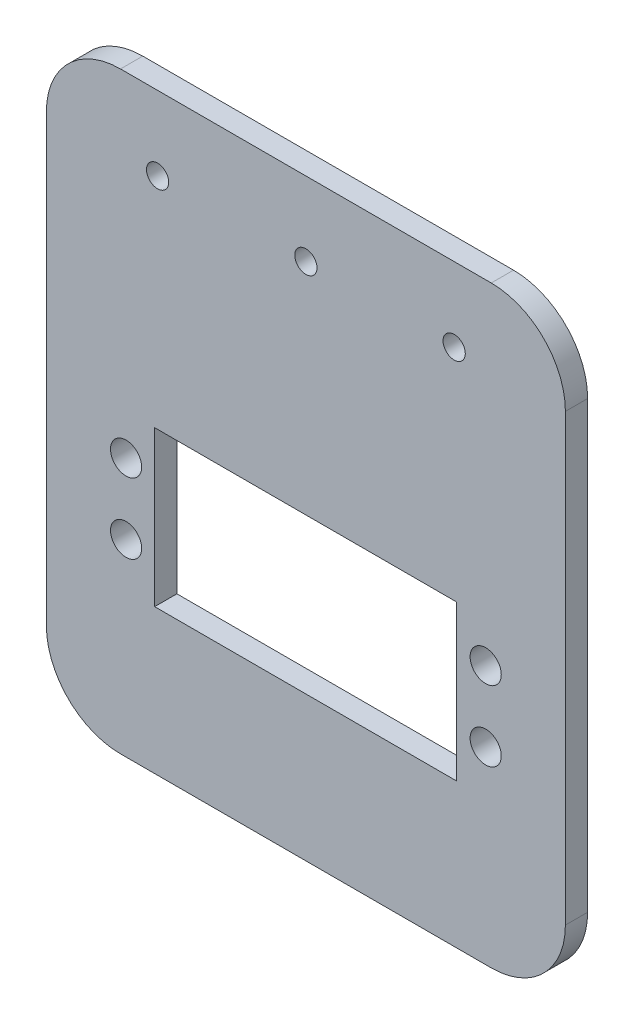
ISO-10303-21;
HEADER;
FILE_DESCRIPTION(('STEP AP214'),'2;1');
FILE_NAME('part.step','',(''),(''),'','','');
FILE_SCHEMA(('AUTOMOTIVE_DESIGN { 1 0 10303 214 1 1 1 1 }'));
ENDSEC;
DATA;
#1=APPLICATION_CONTEXT('core data for automotive mechanical design processes');
#2=APPLICATION_PROTOCOL_DEFINITION('international standard','automotive_design',2000,#1);
#3=PRODUCT_CONTEXT('',#1,'mechanical');
#4=PRODUCT('Part','Part','',(#3));
#5=PRODUCT_RELATED_PRODUCT_CATEGORY('part','',(#4));
#6=PRODUCT_DEFINITION_FORMATION('','',#4);
#7=PRODUCT_DEFINITION_CONTEXT('part definition',#1,'design');
#8=PRODUCT_DEFINITION('design','',#6,#7);
#9=PRODUCT_DEFINITION_SHAPE('','',#8);
#10=(LENGTH_UNIT() NAMED_UNIT(*) SI_UNIT(.MILLI.,.METRE.));
#11=(NAMED_UNIT(*) PLANE_ANGLE_UNIT() SI_UNIT($,.RADIAN.));
#12=(NAMED_UNIT(*) SI_UNIT($,.STERADIAN.) SOLID_ANGLE_UNIT());
#13=UNCERTAINTY_MEASURE_WITH_UNIT(LENGTH_MEASURE(1.E-05),#10,'distance_accuracy_value','');
#14=(GEOMETRIC_REPRESENTATION_CONTEXT(3) GLOBAL_UNCERTAINTY_ASSIGNED_CONTEXT((#13)) GLOBAL_UNIT_ASSIGNED_CONTEXT((#10,
#11,#12)) REPRESENTATION_CONTEXT('',''));
#15=CARTESIAN_POINT('',(0.,0.,0.));
#16=DIRECTION('',(0.,0.,1.));
#17=DIRECTION('',(1.,0.,0.));
#18=AXIS2_PLACEMENT_3D('',#15,#16,#17);
#19=CARTESIAN_POINT('',(35.,40.,3.));
#20=DIRECTION('',(-1.,0.,0.));
#21=DIRECTION('',(0.,-1.,0.));
#22=AXIS2_PLACEMENT_3D('',#19,#20,#21);
#23=PLANE('',#22);
#24=DIRECTION('',(0.,1.,0.));
#25=VECTOR('',#24,1.);
#26=CARTESIAN_POINT('',(35.,40.,3.));
#27=LINE('',#26,#25);
#28=CARTESIAN_POINT('',(35.,-30.,3.));
#29=VERTEX_POINT('',#28);
#30=CARTESIAN_POINT('',(35.,30.,3.));
#31=VERTEX_POINT('',#30);
#32=EDGE_CURVE('E183',#29,#31,#27,.T.);
#33=ORIENTED_EDGE('',*,*,#32,.F.);
#34=DIRECTION('',(0.,0.,-1.));
#35=VECTOR('',#34,1.);
#36=CARTESIAN_POINT('',(35.,-30.,3.));
#37=LINE('',#36,#35);
#38=CARTESIAN_POINT('',(35.,-30.,0.));
#39=VERTEX_POINT('',#38);
#40=EDGE_CURVE('E229',#29,#39,#37,.T.);
#41=ORIENTED_EDGE('',*,*,#40,.T.);
#42=DIRECTION('',(0.,1.,0.));
#43=VECTOR('',#42,1.);
#44=CARTESIAN_POINT('',(35.,40.,0.));
#45=LINE('',#44,#43);
#46=CARTESIAN_POINT('',(35.,30.,0.));
#47=VERTEX_POINT('',#46);
#48=EDGE_CURVE('E182',#39,#47,#45,.T.);
#49=ORIENTED_EDGE('',*,*,#48,.T.);
#50=DIRECTION('',(0.,0.,-1.));
#51=VECTOR('',#50,1.);
#52=CARTESIAN_POINT('',(35.,30.,3.));
#53=LINE('',#52,#51);
#54=EDGE_CURVE('E198',#47,#31,#53,.F.);
#55=ORIENTED_EDGE('',*,*,#54,.T.);
#56=EDGE_LOOP('',(#33,#41,#49,#55));
#57=FACE_BOUND('',#56,.T.);
#58=ADVANCED_FACE('F38',(#57),#23,.F.);
#59=CARTESIAN_POINT('',(-35.,40.,3.));
#60=DIRECTION('',(0.,-1.,0.));
#61=DIRECTION('',(0.,0.,-1.));
#62=AXIS2_PLACEMENT_3D('',#59,#60,#61);
#63=PLANE('',#62);
#64=DIRECTION('',(-1.,0.,0.));
#65=VECTOR('',#64,1.);
#66=CARTESIAN_POINT('',(-35.,40.,0.));
#67=LINE('',#66,#65);
#68=CARTESIAN_POINT('',(25.,40.,0.));
#69=VERTEX_POINT('',#68);
#70=CARTESIAN_POINT('',(-25.,40.,0.));
#71=VERTEX_POINT('',#70);
#72=EDGE_CURVE('E202',#69,#71,#67,.T.);
#73=ORIENTED_EDGE('',*,*,#72,.T.);
#74=DIRECTION('',(0.,0.,-1.));
#75=VECTOR('',#74,1.);
#76=CARTESIAN_POINT('',(-25.,40.,3.));
#77=LINE('',#76,#75);
#78=CARTESIAN_POINT('',(-25.,40.,3.));
#79=VERTEX_POINT('',#78);
#80=EDGE_CURVE('E11',#71,#79,#77,.F.);
#81=ORIENTED_EDGE('',*,*,#80,.T.);
#82=DIRECTION('',(-1.,0.,0.));
#83=VECTOR('',#82,1.);
#84=CARTESIAN_POINT('',(-35.,40.,3.));
#85=LINE('',#84,#83);
#86=CARTESIAN_POINT('',(25.,40.,3.));
#87=VERTEX_POINT('',#86);
#88=EDGE_CURVE('E187',#87,#79,#85,.T.);
#89=ORIENTED_EDGE('',*,*,#88,.F.);
#90=DIRECTION('',(0.,0.,-1.));
#91=VECTOR('',#90,1.);
#92=CARTESIAN_POINT('',(25.,40.,3.));
#93=LINE('',#92,#91);
#94=EDGE_CURVE('E47',#87,#69,#93,.T.);
#95=ORIENTED_EDGE('',*,*,#94,.T.);
#96=EDGE_LOOP('',(#73,#81,#89,#95));
#97=FACE_BOUND('',#96,.T.);
#98=ADVANCED_FACE('F274',(#97),#63,.F.);
#99=CARTESIAN_POINT('',(-35.,40.,3.));
#100=DIRECTION('',(1.,0.,0.));
#101=DIRECTION('',(0.,1.,0.));
#102=AXIS2_PLACEMENT_3D('',#99,#100,#101);
#103=PLANE('',#102);
#104=DIRECTION('',(0.,-1.,0.));
#105=VECTOR('',#104,1.);
#106=CARTESIAN_POINT('',(-35.,40.,0.));
#107=LINE('',#106,#105);
#108=CARTESIAN_POINT('',(-35.,30.,0.));
#109=VERTEX_POINT('',#108);
#110=CARTESIAN_POINT('',(-35.,-30.,0.));
#111=VERTEX_POINT('',#110);
#112=EDGE_CURVE('E206',#109,#111,#107,.T.);
#113=ORIENTED_EDGE('',*,*,#112,.T.);
#114=DIRECTION('',(0.,0.,-1.));
#115=VECTOR('',#114,1.);
#116=CARTESIAN_POINT('',(-35.,-30.,3.));
#117=LINE('',#116,#115);
#118=CARTESIAN_POINT('',(-35.,-30.,3.));
#119=VERTEX_POINT('',#118);
#120=EDGE_CURVE('E54',#111,#119,#117,.F.);
#121=ORIENTED_EDGE('',*,*,#120,.T.);
#122=DIRECTION('',(0.,-1.,0.));
#123=VECTOR('',#122,1.);
#124=CARTESIAN_POINT('',(-35.,40.,3.));
#125=LINE('',#124,#123);
#126=CARTESIAN_POINT('',(-35.,30.,3.));
#127=VERTEX_POINT('',#126);
#128=EDGE_CURVE('E191',#127,#119,#125,.T.);
#129=ORIENTED_EDGE('',*,*,#128,.F.);
#130=DIRECTION('',(0.,0.,-1.));
#131=VECTOR('',#130,1.);
#132=CARTESIAN_POINT('',(-35.,30.,3.));
#133=LINE('',#132,#131);
#134=EDGE_CURVE('E263',#127,#109,#133,.T.);
#135=ORIENTED_EDGE('',*,*,#134,.T.);
#136=EDGE_LOOP('',(#113,#121,#129,#135));
#137=FACE_BOUND('',#136,.T.);
#138=ADVANCED_FACE('F283',(#137),#103,.F.);
#139=CARTESIAN_POINT('',(-35.,-40.,3.));
#140=DIRECTION('',(0.,1.,0.));
#141=DIRECTION('',(0.,0.,1.));
#142=AXIS2_PLACEMENT_3D('',#139,#140,#141);
#143=PLANE('',#142);
#144=DIRECTION('',(1.,0.,0.));
#145=VECTOR('',#144,1.);
#146=CARTESIAN_POINT('',(-35.,-40.,0.));
#147=LINE('',#146,#145);
#148=CARTESIAN_POINT('',(-25.,-40.,0.));
#149=VERTEX_POINT('',#148);
#150=CARTESIAN_POINT('',(25.,-40.,0.));
#151=VERTEX_POINT('',#150);
#152=EDGE_CURVE('E188',#149,#151,#147,.T.);
#153=ORIENTED_EDGE('',*,*,#152,.T.);
#154=DIRECTION('',(0.,0.,-1.));
#155=VECTOR('',#154,1.);
#156=CARTESIAN_POINT('',(25.,-40.,3.));
#157=LINE('',#156,#155);
#158=CARTESIAN_POINT('',(25.,-40.,3.));
#159=VERTEX_POINT('',#158);
#160=EDGE_CURVE('E249',#151,#159,#157,.F.);
#161=ORIENTED_EDGE('',*,*,#160,.T.);
#162=DIRECTION('',(1.,0.,0.));
#163=VECTOR('',#162,1.);
#164=CARTESIAN_POINT('',(-35.,-40.,3.));
#165=LINE('',#164,#163);
#166=CARTESIAN_POINT('',(-25.,-40.,3.));
#167=VERTEX_POINT('',#166);
#168=EDGE_CURVE('E194',#167,#159,#165,.T.);
#169=ORIENTED_EDGE('',*,*,#168,.F.);
#170=DIRECTION('',(0.,0.,-1.));
#171=VECTOR('',#170,1.);
#172=CARTESIAN_POINT('',(-25.,-40.,3.));
#173=LINE('',#172,#171);
#174=EDGE_CURVE('E245',#167,#149,#173,.T.);
#175=ORIENTED_EDGE('',*,*,#174,.T.);
#176=EDGE_LOOP('',(#153,#161,#169,#175));
#177=FACE_BOUND('',#176,.T.);
#178=ADVANCED_FACE('F292',(#177),#143,.F.);
#179=CARTESIAN_POINT('',(0.,0.,3.));
#180=DIRECTION('',(0.,0.,1.));
#181=DIRECTION('',(1.,0.,0.));
#182=AXIS2_PLACEMENT_3D('',#179,#180,#181);
#183=PLANE('',#182);
#184=CARTESIAN_POINT('',(0.,30.,3.));
#185=DIRECTION('',(0.,0.,1.));
#186=DIRECTION('',(1.,0.,0.));
#187=AXIS2_PLACEMENT_3D('',#184,#185,#186);
#188=CIRCLE('',#187,1.5);
#189=CARTESIAN_POINT('',(1.5,30.,3.));
#190=VERTEX_POINT('',#189);
#191=EDGE_CURVE('E223',#190,#190,#188,.T.);
#192=ORIENTED_EDGE('',*,*,#191,.F.);
#193=EDGE_LOOP('',(#192));
#194=FACE_BOUND('',#193,.T.);
#195=CARTESIAN_POINT('',(20.,30.,3.));
#196=DIRECTION('',(0.,0.,1.));
#197=DIRECTION('',(1.,0.,0.));
#198=AXIS2_PLACEMENT_3D('',#195,#196,#197);
#199=CIRCLE('',#198,1.5);
#200=CARTESIAN_POINT('',(21.5,30.,3.));
#201=VERTEX_POINT('',#200);
#202=EDGE_CURVE('E493',#201,#201,#199,.T.);
#203=ORIENTED_EDGE('',*,*,#202,.F.);
#204=EDGE_LOOP('',(#203));
#205=FACE_BOUND('',#204,.T.);
#206=CARTESIAN_POINT('',(-20.,30.,3.));
#207=DIRECTION('',(0.,0.,1.));
#208=DIRECTION('',(1.,0.,0.));
#209=AXIS2_PLACEMENT_3D('',#206,#207,#208);
#210=CIRCLE('',#209,1.5);
#211=CARTESIAN_POINT('',(-18.5,30.,3.));
#212=VERTEX_POINT('',#211);
#213=EDGE_CURVE('E217',#212,#212,#210,.T.);
#214=ORIENTED_EDGE('',*,*,#213,.F.);
#215=EDGE_LOOP('',(#214));
#216=FACE_BOUND('',#215,.T.);
#217=CARTESIAN_POINT('',(-24.25,-14.5749999999999,3.));
#218=DIRECTION('',(0.,0.,1.));
#219=DIRECTION('',(1.,0.,0.));
#220=AXIS2_PLACEMENT_3D('',#217,#218,#219);
#221=CIRCLE('',#220,2.10000000000001);
#222=CARTESIAN_POINT('',(-22.15,-14.5749999999999,3.));
#223=VERTEX_POINT('',#222);
#224=EDGE_CURVE('E500',#223,#223,#221,.T.);
#225=ORIENTED_EDGE('',*,*,#224,.F.);
#226=EDGE_LOOP('',(#225));
#227=FACE_BOUND('',#226,.T.);
#228=CARTESIAN_POINT('',(-24.25,-5.07499999999994,3.));
#229=DIRECTION('',(0.,0.,1.));
#230=DIRECTION('',(1.,0.,0.));
#231=AXIS2_PLACEMENT_3D('',#228,#229,#230);
#232=CIRCLE('',#231,2.1);
#233=CARTESIAN_POINT('',(-22.15,-5.07499999999994,3.));
#234=VERTEX_POINT('',#233);
#235=EDGE_CURVE('E504',#234,#234,#232,.T.);
#236=ORIENTED_EDGE('',*,*,#235,.F.);
#237=EDGE_LOOP('',(#236));
#238=FACE_BOUND('',#237,.T.);
#239=CARTESIAN_POINT('',(24.25,-14.5749999999999,3.));
#240=DIRECTION('',(0.,0.,1.));
#241=DIRECTION('',(1.,0.,0.));
#242=AXIS2_PLACEMENT_3D('',#239,#240,#241);
#243=CIRCLE('',#242,2.10000000000001);
#244=CARTESIAN_POINT('',(26.35,-14.5749999999999,3.));
#245=VERTEX_POINT('',#244);
#246=EDGE_CURVE('E508',#245,#245,#243,.T.);
#247=ORIENTED_EDGE('',*,*,#246,.F.);
#248=EDGE_LOOP('',(#247));
#249=FACE_BOUND('',#248,.T.);
#250=CARTESIAN_POINT('',(24.25,-5.07499999999994,3.));
#251=DIRECTION('',(0.,0.,1.));
#252=DIRECTION('',(1.,0.,0.));
#253=AXIS2_PLACEMENT_3D('',#250,#251,#252);
#254=CIRCLE('',#253,2.1);
#255=CARTESIAN_POINT('',(26.35,-5.07499999999994,3.));
#256=VERTEX_POINT('',#255);
#257=EDGE_CURVE('E512',#256,#256,#254,.T.);
#258=ORIENTED_EDGE('',*,*,#257,.F.);
#259=EDGE_LOOP('',(#258));
#260=FACE_BOUND('',#259,.T.);
#261=DIRECTION('',(0.,1.,0.));
#262=VECTOR('',#261,1.);
#263=CARTESIAN_POINT('',(20.2835865410944,0.,3.));
#264=LINE('',#263,#262);
#265=CARTESIAN_POINT('',(20.2835865410944,-20.5028500907677,3.));
#266=VERTEX_POINT('',#265);
#267=CARTESIAN_POINT('',(20.2835865410944,0.404134736421709,3.));
#268=VERTEX_POINT('',#267);
#269=EDGE_CURVE('E179',#266,#268,#264,.T.);
#270=ORIENTED_EDGE('',*,*,#269,.F.);
#271=DIRECTION('',(1.,0.,0.));
#272=VECTOR('',#271,1.);
#273=CARTESIAN_POINT('',(0.,-20.5028500907677,3.));
#274=LINE('',#273,#272);
#275=CARTESIAN_POINT('',(-20.3932656895139,-20.5028500907677,3.));
#276=VERTEX_POINT('',#275);
#277=EDGE_CURVE('E167',#276,#266,#274,.T.);
#278=ORIENTED_EDGE('',*,*,#277,.F.);
#279=DIRECTION('',(0.,-1.,0.));
#280=VECTOR('',#279,1.);
#281=CARTESIAN_POINT('',(-20.3932656895139,0.,3.));
#282=LINE('',#281,#280);
#283=CARTESIAN_POINT('',(-20.3932656895139,0.404134736421709,3.));
#284=VERTEX_POINT('',#283);
#285=EDGE_CURVE('E137',#284,#276,#282,.T.);
#286=ORIENTED_EDGE('',*,*,#285,.F.);
#287=DIRECTION('',(-1.,0.,0.));
#288=VECTOR('',#287,1.);
#289=CARTESIAN_POINT('',(0.,0.404134736421709,3.));
#290=LINE('',#289,#288);
#291=EDGE_CURVE('E176',#268,#284,#290,.T.);
#292=ORIENTED_EDGE('',*,*,#291,.F.);
#293=EDGE_LOOP('',(#270,#278,#286,#292));
#294=FACE_BOUND('',#293,.T.);
#295=ORIENTED_EDGE('',*,*,#168,.T.);
#296=CARTESIAN_POINT('',(25.,-30.,3.));
#297=DIRECTION('',(0.,0.,1.));
#298=DIRECTION('',(1.,0.,0.));
#299=AXIS2_PLACEMENT_3D('',#296,#297,#298);
#300=CIRCLE('',#299,10.);
#301=EDGE_CURVE('E260',#159,#29,#300,.T.);
#302=ORIENTED_EDGE('',*,*,#301,.T.);
#303=ORIENTED_EDGE('',*,*,#32,.T.);
#304=CARTESIAN_POINT('',(25.,30.,3.));
#305=DIRECTION('',(0.,0.,1.));
#306=DIRECTION('',(1.,0.,0.));
#307=AXIS2_PLACEMENT_3D('',#304,#305,#306);
#308=CIRCLE('',#307,10.);
#309=EDGE_CURVE('E252',#31,#87,#308,.T.);
#310=ORIENTED_EDGE('',*,*,#309,.T.);
#311=ORIENTED_EDGE('',*,*,#88,.T.);
#312=CARTESIAN_POINT('',(-25.,30.,3.));
#313=DIRECTION('',(0.,0.,1.));
#314=DIRECTION('',(1.,0.,0.));
#315=AXIS2_PLACEMENT_3D('',#312,#313,#314);
#316=CIRCLE('',#315,10.);
#317=EDGE_CURVE('E61',#79,#127,#316,.T.);
#318=ORIENTED_EDGE('',*,*,#317,.T.);
#319=ORIENTED_EDGE('',*,*,#128,.T.);
#320=CARTESIAN_POINT('',(-25.,-30.,3.));
#321=DIRECTION('',(0.,0.,1.));
#322=DIRECTION('',(1.,0.,0.));
#323=AXIS2_PLACEMENT_3D('',#320,#321,#322);
#324=CIRCLE('',#323,10.);
#325=EDGE_CURVE('E257',#119,#167,#324,.T.);
#326=ORIENTED_EDGE('',*,*,#325,.T.);
#327=EDGE_LOOP('',(#295,#302,#303,#310,#311,#318,#319,#326));
#328=FACE_BOUND('',#327,.T.);
#329=ADVANCED_FACE('F285',(#194,#205,#216,#227,#238,#249,#260,#294,#328),#183,.T.);
#330=CARTESIAN_POINT('',(0.,0.,0.));
#331=DIRECTION('',(0.,0.,1.));
#332=DIRECTION('',(1.,0.,0.));
#333=AXIS2_PLACEMENT_3D('',#330,#331,#332);
#334=PLANE('',#333);
#335=CARTESIAN_POINT('',(0.,30.,0.));
#336=DIRECTION('',(0.,0.,1.));
#337=DIRECTION('',(1.,0.,0.));
#338=AXIS2_PLACEMENT_3D('',#335,#336,#337);
#339=CIRCLE('',#338,1.5);
#340=CARTESIAN_POINT('',(1.5,30.,0.));
#341=VERTEX_POINT('',#340);
#342=EDGE_CURVE('E222',#341,#341,#339,.T.);
#343=ORIENTED_EDGE('',*,*,#342,.T.);
#344=EDGE_LOOP('',(#343));
#345=FACE_BOUND('',#344,.T.);
#346=CARTESIAN_POINT('',(20.,30.,0.));
#347=DIRECTION('',(0.,0.,1.));
#348=DIRECTION('',(1.,0.,0.));
#349=AXIS2_PLACEMENT_3D('',#346,#347,#348);
#350=CIRCLE('',#349,1.5);
#351=CARTESIAN_POINT('',(21.5,30.,0.));
#352=VERTEX_POINT('',#351);
#353=EDGE_CURVE('E218',#352,#352,#350,.T.);
#354=ORIENTED_EDGE('',*,*,#353,.T.);
#355=EDGE_LOOP('',(#354));
#356=FACE_BOUND('',#355,.T.);
#357=CARTESIAN_POINT('',(-20.,30.,0.));
#358=DIRECTION('',(0.,0.,1.));
#359=DIRECTION('',(1.,0.,0.));
#360=AXIS2_PLACEMENT_3D('',#357,#358,#359);
#361=CIRCLE('',#360,1.5);
#362=CARTESIAN_POINT('',(-18.5,30.,0.));
#363=VERTEX_POINT('',#362);
#364=EDGE_CURVE('E212',#363,#363,#361,.T.);
#365=ORIENTED_EDGE('',*,*,#364,.T.);
#366=EDGE_LOOP('',(#365));
#367=FACE_BOUND('',#366,.T.);
#368=CARTESIAN_POINT('',(-24.25,-14.5749999999999,0.));
#369=DIRECTION('',(0.,0.,-1.));
#370=DIRECTION('',(-1.,0.,0.));
#371=AXIS2_PLACEMENT_3D('',#368,#369,#370);
#372=CIRCLE('',#371,2.10000000000001);
#373=CARTESIAN_POINT('',(-26.35,-14.5749999999999,0.));
#374=VERTEX_POINT('',#373);
#375=EDGE_CURVE('E526',#374,#374,#372,.T.);
#376=ORIENTED_EDGE('',*,*,#375,.F.);
#377=EDGE_LOOP('',(#376));
#378=FACE_BOUND('',#377,.T.);
#379=CARTESIAN_POINT('',(-24.25,-5.07499999999994,0.));
#380=DIRECTION('',(0.,0.,-1.));
#381=DIRECTION('',(-1.,0.,0.));
#382=AXIS2_PLACEMENT_3D('',#379,#380,#381);
#383=CIRCLE('',#382,2.1);
#384=CARTESIAN_POINT('',(-26.35,-5.07499999999994,0.));
#385=VERTEX_POINT('',#384);
#386=EDGE_CURVE('E534',#385,#385,#383,.T.);
#387=ORIENTED_EDGE('',*,*,#386,.F.);
#388=EDGE_LOOP('',(#387));
#389=FACE_BOUND('',#388,.T.);
#390=CARTESIAN_POINT('',(24.25,-14.5749999999999,0.));
#391=DIRECTION('',(0.,0.,-1.));
#392=DIRECTION('',(-1.,0.,0.));
#393=AXIS2_PLACEMENT_3D('',#390,#391,#392);
#394=CIRCLE('',#393,2.10000000000001);
#395=CARTESIAN_POINT('',(22.15,-14.5749999999999,0.));
#396=VERTEX_POINT('',#395);
#397=EDGE_CURVE('E530',#396,#396,#394,.T.);
#398=ORIENTED_EDGE('',*,*,#397,.F.);
#399=EDGE_LOOP('',(#398));
#400=FACE_BOUND('',#399,.T.);
#401=CARTESIAN_POINT('',(24.25,-5.07499999999994,0.));
#402=DIRECTION('',(0.,0.,-1.));
#403=DIRECTION('',(-1.,0.,0.));
#404=AXIS2_PLACEMENT_3D('',#401,#402,#403);
#405=CIRCLE('',#404,2.1);
#406=CARTESIAN_POINT('',(22.15,-5.07499999999994,0.));
#407=VERTEX_POINT('',#406);
#408=EDGE_CURVE('E216',#407,#407,#405,.T.);
#409=ORIENTED_EDGE('',*,*,#408,.F.);
#410=EDGE_LOOP('',(#409));
#411=FACE_BOUND('',#410,.T.);
#412=DIRECTION('',(-1.,0.,0.));
#413=VECTOR('',#412,1.);
#414=CARTESIAN_POINT('',(20.2835865410944,-20.5028500907677,0.));
#415=LINE('',#414,#413);
#416=CARTESIAN_POINT('',(20.2835865410944,-20.5028500907677,0.));
#417=VERTEX_POINT('',#416);
#418=CARTESIAN_POINT('',(-20.3932656895139,-20.5028500907677,0.));
#419=VERTEX_POINT('',#418);
#420=EDGE_CURVE('E146',#417,#419,#415,.T.);
#421=ORIENTED_EDGE('',*,*,#420,.F.);
#422=DIRECTION('',(0.,-1.,0.));
#423=VECTOR('',#422,1.);
#424=CARTESIAN_POINT('',(20.2835865410944,0.404134736421709,0.));
#425=LINE('',#424,#423);
#426=CARTESIAN_POINT('',(20.2835865410944,0.404134736421709,0.));
#427=VERTEX_POINT('',#426);
#428=EDGE_CURVE('E152',#427,#417,#425,.T.);
#429=ORIENTED_EDGE('',*,*,#428,.F.);
#430=DIRECTION('',(1.,0.,0.));
#431=VECTOR('',#430,1.);
#432=CARTESIAN_POINT('',(20.2835865410944,0.404134736421709,0.));
#433=LINE('',#432,#431);
#434=CARTESIAN_POINT('',(-20.3932656895139,0.404134736421709,0.));
#435=VERTEX_POINT('',#434);
#436=EDGE_CURVE('E157',#435,#427,#433,.T.);
#437=ORIENTED_EDGE('',*,*,#436,.F.);
#438=DIRECTION('',(0.,1.,0.));
#439=VECTOR('',#438,1.);
#440=CARTESIAN_POINT('',(-20.3932656895139,0.404134736421709,0.));
#441=LINE('',#440,#439);
#442=EDGE_CURVE('E134',#419,#435,#441,.T.);
#443=ORIENTED_EDGE('',*,*,#442,.F.);
#444=EDGE_LOOP('',(#421,#429,#437,#443));
#445=FACE_BOUND('',#444,.T.);
#446=ORIENTED_EDGE('',*,*,#48,.F.);
#447=CARTESIAN_POINT('',(25.,-30.,0.));
#448=DIRECTION('',(0.,0.,1.));
#449=DIRECTION('',(1.,0.,0.));
#450=AXIS2_PLACEMENT_3D('',#447,#448,#449);
#451=CIRCLE('',#450,10.);
#452=EDGE_CURVE('E242',#39,#151,#451,.F.);
#453=ORIENTED_EDGE('',*,*,#452,.T.);
#454=ORIENTED_EDGE('',*,*,#152,.F.);
#455=CARTESIAN_POINT('',(-25.,-30.,0.));
#456=DIRECTION('',(0.,0.,1.));
#457=DIRECTION('',(1.,0.,0.));
#458=AXIS2_PLACEMENT_3D('',#455,#456,#457);
#459=CIRCLE('',#458,10.);
#460=EDGE_CURVE('E239',#149,#111,#459,.F.);
#461=ORIENTED_EDGE('',*,*,#460,.T.);
#462=ORIENTED_EDGE('',*,*,#112,.F.);
#463=CARTESIAN_POINT('',(-25.,30.,0.));
#464=DIRECTION('',(0.,0.,1.));
#465=DIRECTION('',(1.,0.,0.));
#466=AXIS2_PLACEMENT_3D('',#463,#464,#465);
#467=CIRCLE('',#466,10.);
#468=EDGE_CURVE('E236',#109,#71,#467,.F.);
#469=ORIENTED_EDGE('',*,*,#468,.T.);
#470=ORIENTED_EDGE('',*,*,#72,.F.);
#471=CARTESIAN_POINT('',(25.,30.,0.));
#472=DIRECTION('',(0.,0.,1.));
#473=DIRECTION('',(1.,0.,0.));
#474=AXIS2_PLACEMENT_3D('',#471,#472,#473);
#475=CIRCLE('',#474,10.);
#476=EDGE_CURVE('E233',#69,#47,#475,.F.);
#477=ORIENTED_EDGE('',*,*,#476,.T.);
#478=EDGE_LOOP('',(#446,#453,#454,#461,#462,#469,#470,#477));
#479=FACE_BOUND('',#478,.T.);
#480=ADVANCED_FACE('F154',(#345,#356,#367,#378,#389,#400,#411,#445,#479),#334,.F.);
#481=CARTESIAN_POINT('',(20.2835865410944,0.404134736421709,10.));
#482=DIRECTION('',(1.,0.,0.));
#483=DIRECTION('',(0.,0.,-1.));
#484=AXIS2_PLACEMENT_3D('',#481,#482,#483);
#485=PLANE('',#484);
#486=ORIENTED_EDGE('',*,*,#269,.T.);
#487=DIRECTION('',(0.,0.,-1.));
#488=VECTOR('',#487,1.);
#489=CARTESIAN_POINT('',(20.2835865410944,0.404134736421709,10.));
#490=LINE('',#489,#488);
#491=EDGE_CURVE('E164',#268,#427,#490,.T.);
#492=ORIENTED_EDGE('',*,*,#491,.T.);
#493=ORIENTED_EDGE('',*,*,#428,.T.);
#494=DIRECTION('',(0.,0.,-1.));
#495=VECTOR('',#494,1.);
#496=CARTESIAN_POINT('',(20.2835865410944,-20.5028500907677,10.));
#497=LINE('',#496,#495);
#498=EDGE_CURVE('E142',#266,#417,#497,.T.);
#499=ORIENTED_EDGE('',*,*,#498,.F.);
#500=EDGE_LOOP('',(#486,#492,#493,#499));
#501=FACE_BOUND('',#500,.T.);
#502=ADVANCED_FACE('F423',(#501),#485,.F.);
#503=CARTESIAN_POINT('',(20.2835865410944,0.404134736421709,10.));
#504=DIRECTION('',(0.,1.,0.));
#505=DIRECTION('',(0.,0.,1.));
#506=AXIS2_PLACEMENT_3D('',#503,#504,#505);
#507=PLANE('',#506);
#508=ORIENTED_EDGE('',*,*,#291,.T.);
#509=DIRECTION('',(0.,0.,-1.));
#510=VECTOR('',#509,1.);
#511=CARTESIAN_POINT('',(-20.3932656895139,0.404134736421709,10.));
#512=LINE('',#511,#510);
#513=EDGE_CURVE('E141',#284,#435,#512,.T.);
#514=ORIENTED_EDGE('',*,*,#513,.T.);
#515=ORIENTED_EDGE('',*,*,#436,.T.);
#516=ORIENTED_EDGE('',*,*,#491,.F.);
#517=EDGE_LOOP('',(#508,#514,#515,#516));
#518=FACE_BOUND('',#517,.T.);
#519=ADVANCED_FACE('F415',(#518),#507,.F.);
#520=CARTESIAN_POINT('',(-20.3932656895139,0.404134736421709,10.));
#521=DIRECTION('',(-1.,0.,0.));
#522=DIRECTION('',(0.,0.,1.));
#523=AXIS2_PLACEMENT_3D('',#520,#521,#522);
#524=PLANE('',#523);
#525=ORIENTED_EDGE('',*,*,#285,.T.);
#526=DIRECTION('',(0.,0.,-1.));
#527=VECTOR('',#526,1.);
#528=CARTESIAN_POINT('',(-20.3932656895139,-20.5028500907677,10.));
#529=LINE('',#528,#527);
#530=EDGE_CURVE('E129',#276,#419,#529,.T.);
#531=ORIENTED_EDGE('',*,*,#530,.T.);
#532=ORIENTED_EDGE('',*,*,#442,.T.);
#533=ORIENTED_EDGE('',*,*,#513,.F.);
#534=EDGE_LOOP('',(#525,#531,#532,#533));
#535=FACE_BOUND('',#534,.T.);
#536=ADVANCED_FACE('F131',(#535),#524,.F.);
#537=CARTESIAN_POINT('',(20.2835865410944,-20.5028500907677,10.));
#538=DIRECTION('',(0.,-1.,0.));
#539=DIRECTION('',(0.,0.,-1.));
#540=AXIS2_PLACEMENT_3D('',#537,#538,#539);
#541=PLANE('',#540);
#542=ORIENTED_EDGE('',*,*,#277,.T.);
#543=ORIENTED_EDGE('',*,*,#498,.T.);
#544=ORIENTED_EDGE('',*,*,#420,.T.);
#545=ORIENTED_EDGE('',*,*,#530,.F.);
#546=EDGE_LOOP('',(#542,#543,#544,#545));
#547=FACE_BOUND('',#546,.T.);
#548=ADVANCED_FACE('F147',(#547),#541,.F.);
#549=CARTESIAN_POINT('',(24.25,-5.07499999999994,10.));
#550=DIRECTION('',(0.,0.,-1.));
#551=DIRECTION('',(-1.,0.,0.));
#552=AXIS2_PLACEMENT_3D('',#549,#550,#551);
#553=CYLINDRICAL_SURFACE('',#552,2.1);
#554=ORIENTED_EDGE('',*,*,#257,.T.);
#555=EDGE_LOOP('',(#554));
#556=FACE_BOUND('',#555,.T.);
#557=ORIENTED_EDGE('',*,*,#408,.T.);
#558=EDGE_LOOP('',(#557));
#559=FACE_BOUND('',#558,.T.);
#560=ADVANCED_FACE('F391',(#556,#559),#553,.F.);
#561=CARTESIAN_POINT('',(24.25,-14.5749999999999,10.));
#562=DIRECTION('',(0.,0.,-1.));
#563=DIRECTION('',(-1.,0.,0.));
#564=AXIS2_PLACEMENT_3D('',#561,#562,#563);
#565=CYLINDRICAL_SURFACE('',#564,2.10000000000001);
#566=ORIENTED_EDGE('',*,*,#246,.T.);
#567=EDGE_LOOP('',(#566));
#568=FACE_BOUND('',#567,.T.);
#569=ORIENTED_EDGE('',*,*,#397,.T.);
#570=EDGE_LOOP('',(#569));
#571=FACE_BOUND('',#570,.T.);
#572=ADVANCED_FACE('F382',(#568,#571),#565,.F.);
#573=CARTESIAN_POINT('',(-24.25,-5.07499999999994,10.));
#574=DIRECTION('',(0.,0.,-1.));
#575=DIRECTION('',(-1.,0.,0.));
#576=AXIS2_PLACEMENT_3D('',#573,#574,#575);
#577=CYLINDRICAL_SURFACE('',#576,2.1);
#578=ORIENTED_EDGE('',*,*,#235,.T.);
#579=EDGE_LOOP('',(#578));
#580=FACE_BOUND('',#579,.T.);
#581=ORIENTED_EDGE('',*,*,#386,.T.);
#582=EDGE_LOOP('',(#581));
#583=FACE_BOUND('',#582,.T.);
#584=ADVANCED_FACE('F373',(#580,#583),#577,.F.);
#585=CARTESIAN_POINT('',(-24.25,-14.5749999999999,10.));
#586=DIRECTION('',(0.,0.,-1.));
#587=DIRECTION('',(-1.,0.,0.));
#588=AXIS2_PLACEMENT_3D('',#585,#586,#587);
#589=CYLINDRICAL_SURFACE('',#588,2.10000000000001);
#590=ORIENTED_EDGE('',*,*,#224,.T.);
#591=EDGE_LOOP('',(#590));
#592=FACE_BOUND('',#591,.T.);
#593=ORIENTED_EDGE('',*,*,#375,.T.);
#594=EDGE_LOOP('',(#593));
#595=FACE_BOUND('',#594,.T.);
#596=ADVANCED_FACE('F364',(#592,#595),#589,.F.);
#597=CARTESIAN_POINT('',(-20.,30.,-7.));
#598=DIRECTION('',(0.,0.,1.));
#599=DIRECTION('',(1.,0.,0.));
#600=AXIS2_PLACEMENT_3D('',#597,#598,#599);
#601=CYLINDRICAL_SURFACE('',#600,1.5);
#602=ORIENTED_EDGE('',*,*,#213,.T.);
#603=EDGE_LOOP('',(#602));
#604=FACE_BOUND('',#603,.T.);
#605=ORIENTED_EDGE('',*,*,#364,.F.);
#606=EDGE_LOOP('',(#605));
#607=FACE_BOUND('',#606,.T.);
#608=ADVANCED_FACE('F355',(#604,#607),#601,.F.);
#609=CARTESIAN_POINT('',(20.,30.,-7.));
#610=DIRECTION('',(0.,0.,1.));
#611=DIRECTION('',(1.,0.,0.));
#612=AXIS2_PLACEMENT_3D('',#609,#610,#611);
#613=CYLINDRICAL_SURFACE('',#612,1.5);
#614=ORIENTED_EDGE('',*,*,#202,.T.);
#615=EDGE_LOOP('',(#614));
#616=FACE_BOUND('',#615,.T.);
#617=ORIENTED_EDGE('',*,*,#353,.F.);
#618=EDGE_LOOP('',(#617));
#619=FACE_BOUND('',#618,.T.);
#620=ADVANCED_FACE('F346',(#616,#619),#613,.F.);
#621=CARTESIAN_POINT('',(0.,30.,-7.));
#622=DIRECTION('',(0.,0.,1.));
#623=DIRECTION('',(1.,0.,0.));
#624=AXIS2_PLACEMENT_3D('',#621,#622,#623);
#625=CYLINDRICAL_SURFACE('',#624,1.5);
#626=ORIENTED_EDGE('',*,*,#191,.T.);
#627=EDGE_LOOP('',(#626));
#628=FACE_BOUND('',#627,.T.);
#629=ORIENTED_EDGE('',*,*,#342,.F.);
#630=EDGE_LOOP('',(#629));
#631=FACE_BOUND('',#630,.T.);
#632=ADVANCED_FACE('F315',(#628,#631),#625,.F.);
#633=CARTESIAN_POINT('',(25.,-30.,3.));
#634=DIRECTION('',(0.,0.,-1.));
#635=DIRECTION('',(-1.,0.,0.));
#636=AXIS2_PLACEMENT_3D('',#633,#634,#635);
#637=CYLINDRICAL_SURFACE('',#636,10.);
#638=ORIENTED_EDGE('',*,*,#301,.F.);
#639=ORIENTED_EDGE('',*,*,#160,.F.);
#640=ORIENTED_EDGE('',*,*,#452,.F.);
#641=ORIENTED_EDGE('',*,*,#40,.F.);
#642=EDGE_LOOP('',(#638,#639,#640,#641));
#643=FACE_BOUND('',#642,.T.);
#644=ADVANCED_FACE('F297',(#643),#637,.T.);
#645=CARTESIAN_POINT('',(-25.,-30.,3.));
#646=DIRECTION('',(0.,0.,-1.));
#647=DIRECTION('',(-1.,0.,0.));
#648=AXIS2_PLACEMENT_3D('',#645,#646,#647);
#649=CYLINDRICAL_SURFACE('',#648,10.);
#650=ORIENTED_EDGE('',*,*,#325,.F.);
#651=ORIENTED_EDGE('',*,*,#120,.F.);
#652=ORIENTED_EDGE('',*,*,#460,.F.);
#653=ORIENTED_EDGE('',*,*,#174,.F.);
#654=EDGE_LOOP('',(#650,#651,#652,#653));
#655=FACE_BOUND('',#654,.T.);
#656=ADVANCED_FACE('F289',(#655),#649,.T.);
#657=CARTESIAN_POINT('',(-25.,30.,3.));
#658=DIRECTION('',(0.,0.,-1.));
#659=DIRECTION('',(-1.,0.,0.));
#660=AXIS2_PLACEMENT_3D('',#657,#658,#659);
#661=CYLINDRICAL_SURFACE('',#660,10.);
#662=ORIENTED_EDGE('',*,*,#317,.F.);
#663=ORIENTED_EDGE('',*,*,#80,.F.);
#664=ORIENTED_EDGE('',*,*,#468,.F.);
#665=ORIENTED_EDGE('',*,*,#134,.F.);
#666=EDGE_LOOP('',(#662,#663,#664,#665));
#667=FACE_BOUND('',#666,.T.);
#668=ADVANCED_FACE('F282',(#667),#661,.T.);
#669=CARTESIAN_POINT('',(25.,30.,3.));
#670=DIRECTION('',(0.,0.,-1.));
#671=DIRECTION('',(-1.,0.,0.));
#672=AXIS2_PLACEMENT_3D('',#669,#670,#671);
#673=CYLINDRICAL_SURFACE('',#672,10.);
#674=ORIENTED_EDGE('',*,*,#309,.F.);
#675=ORIENTED_EDGE('',*,*,#54,.F.);
#676=ORIENTED_EDGE('',*,*,#476,.F.);
#677=ORIENTED_EDGE('',*,*,#94,.F.);
#678=EDGE_LOOP('',(#674,#675,#676,#677));
#679=FACE_BOUND('',#678,.T.);
#680=ADVANCED_FACE('F40',(#679),#673,.T.);
#681=CLOSED_SHELL('',(#58,#98,#138,#178,#329,#480,#502,#519,#536,#548,#560,#572,#584,#596,#608,
#620,#632,#644,#656,#668,#680));
#682=MANIFOLD_SOLID_BREP('B2',#681);
#683=ADVANCED_BREP_SHAPE_REPRESENTATION('',(#18,#682),#14);
#684=SHAPE_DEFINITION_REPRESENTATION(#9,#683);
ENDSEC;
END-ISO-10303-21;
